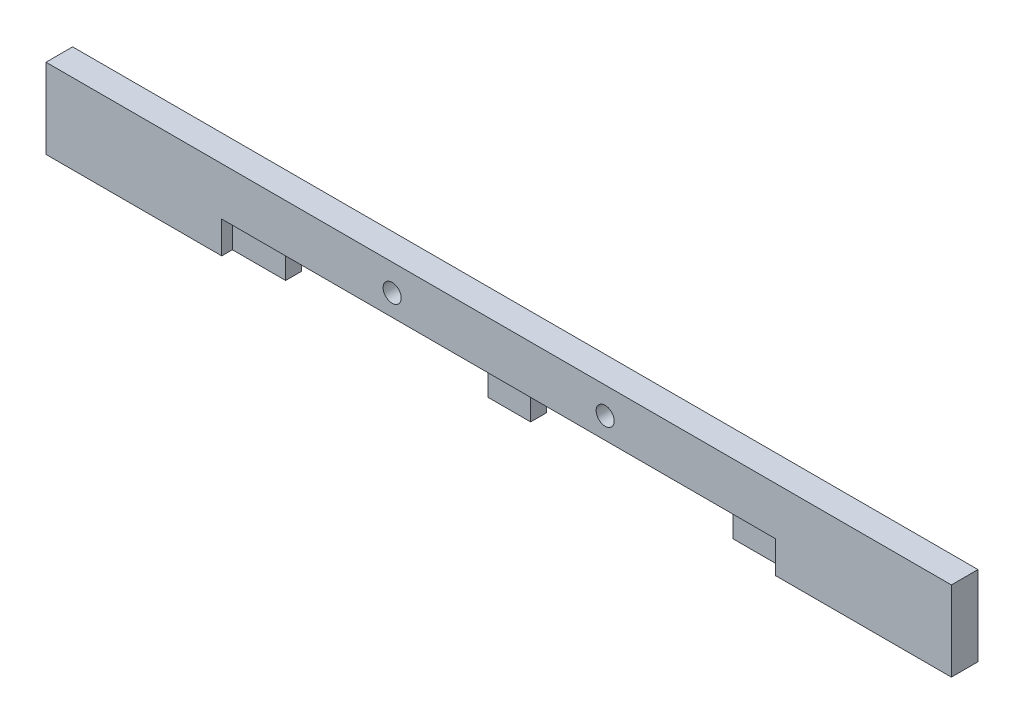
ISO-10303-21;
HEADER;
FILE_DESCRIPTION(('STEP AP214'),'2;1');
FILE_NAME('part.step','',(''),(''),'','','');
FILE_SCHEMA(('AUTOMOTIVE_DESIGN { 1 0 10303 214 1 1 1 1 }'));
ENDSEC;
DATA;
#1=APPLICATION_CONTEXT('core data for automotive mechanical design processes');
#2=APPLICATION_PROTOCOL_DEFINITION('international standard','automotive_design',2000,#1);
#3=PRODUCT_CONTEXT('',#1,'mechanical');
#4=PRODUCT('Part','Part','',(#3));
#5=PRODUCT_RELATED_PRODUCT_CATEGORY('part','',(#4));
#6=PRODUCT_DEFINITION_FORMATION('','',#4);
#7=PRODUCT_DEFINITION_CONTEXT('part definition',#1,'design');
#8=PRODUCT_DEFINITION('design','',#6,#7);
#9=PRODUCT_DEFINITION_SHAPE('','',#8);
#10=(LENGTH_UNIT() NAMED_UNIT(*) SI_UNIT(.MILLI.,.METRE.));
#11=(NAMED_UNIT(*) PLANE_ANGLE_UNIT() SI_UNIT($,.RADIAN.));
#12=(NAMED_UNIT(*) SI_UNIT($,.STERADIAN.) SOLID_ANGLE_UNIT());
#13=UNCERTAINTY_MEASURE_WITH_UNIT(LENGTH_MEASURE(1.E-05),#10,'distance_accuracy_value','');
#14=(GEOMETRIC_REPRESENTATION_CONTEXT(3) GLOBAL_UNCERTAINTY_ASSIGNED_CONTEXT((#13)) GLOBAL_UNIT_ASSIGNED_CONTEXT((#10,
#11,#12)) REPRESENTATION_CONTEXT('',''));
#15=CARTESIAN_POINT('',(0.,0.,0.));
#16=DIRECTION('',(0.,0.,1.));
#17=DIRECTION('',(1.,0.,0.));
#18=AXIS2_PLACEMENT_3D('',#15,#16,#17);
#19=CARTESIAN_POINT('',(-29.7998399771398,17.5410874971466,3.0000000000001));
#20=DIRECTION('',(0.,0.,-1.));
#21=DIRECTION('',(-1.,0.,0.));
#22=AXIS2_PLACEMENT_3D('',#19,#20,#21);
#23=PLANE('',#22);
#24=DIRECTION('',(1.,0.,0.));
#25=VECTOR('',#24,1.);
#26=CARTESIAN_POINT('',(-104.199192033432,34.2398452611218,3.00000000000009));
#27=LINE('',#26,#25);
#28=CARTESIAN_POINT('',(-56.1991920334325,34.2398452611218,3.00000000000009));
#29=VERTEX_POINT('',#28);
#30=CARTESIAN_POINT('',(-48.1991920334325,34.2398452611218,3.00000000000009));
#31=VERTEX_POINT('',#30);
#32=EDGE_CURVE('E152',#29,#31,#27,.T.);
#33=ORIENTED_EDGE('',*,*,#32,.F.);
#34=DIRECTION('',(0.,1.,0.));
#35=VECTOR('',#34,1.);
#36=CARTESIAN_POINT('',(-56.1991920334325,28.2398452611219,3.00000000000009));
#37=LINE('',#36,#35);
#38=CARTESIAN_POINT('',(-56.1991920334325,28.2398452611219,3.00000000000009));
#39=VERTEX_POINT('',#38);
#40=EDGE_CURVE('E161',#39,#29,#37,.T.);
#41=ORIENTED_EDGE('',*,*,#40,.F.);
#42=DIRECTION('',(-1.,0.,0.));
#43=VECTOR('',#42,1.);
#44=CARTESIAN_POINT('',(-0.199192033432466,28.2398452611219,3.00000000000009));
#45=LINE('',#44,#43);
#46=CARTESIAN_POINT('',(-48.1991920334325,28.2398452611219,3.00000000000009));
#47=VERTEX_POINT('',#46);
#48=EDGE_CURVE('E256',#47,#39,#45,.T.);
#49=ORIENTED_EDGE('',*,*,#48,.F.);
#50=DIRECTION('',(0.,-1.,0.));
#51=VECTOR('',#50,1.);
#52=CARTESIAN_POINT('',(-48.1991920334325,34.2398452611218,3.00000000000009));
#53=LINE('',#52,#51);
#54=EDGE_CURVE('E170',#31,#47,#53,.T.);
#55=ORIENTED_EDGE('',*,*,#54,.F.);
#56=EDGE_LOOP('',(#33,#41,#49,#55));
#57=FACE_BOUND('',#56,.T.);
#58=ADVANCED_FACE('F33',(#57),#23,.F.);
#59=CARTESIAN_POINT('',(-94.1991920334325,28.2398452611219,3.00000000000012));
#60=VERTEX_POINT('',#59);
#61=CARTESIAN_POINT('',(-104.199192033432,28.2398452611219,3.00000000000012));
#62=VERTEX_POINT('',#61);
#63=EDGE_CURVE('E257',#60,#62,#45,.T.);
#64=ORIENTED_EDGE('',*,*,#63,.F.);
#65=DIRECTION('',(0.,-1.,0.));
#66=VECTOR('',#65,1.);
#67=CARTESIAN_POINT('',(-94.1991920334325,28.2398452611219,3.00000000000009));
#68=LINE('',#67,#66);
#69=CARTESIAN_POINT('',(-94.1991920334325,34.2398452611218,3.00000000000009));
#70=VERTEX_POINT('',#69);
#71=EDGE_CURVE('E48',#70,#60,#68,.T.);
#72=ORIENTED_EDGE('',*,*,#71,.F.);
#73=CARTESIAN_POINT('',(-104.199192033432,34.2398452611218,3.00000000000009));
#74=VERTEX_POINT('',#73);
#75=EDGE_CURVE('E171',#74,#70,#27,.T.);
#76=ORIENTED_EDGE('',*,*,#75,.F.);
#77=DIRECTION('',(0.,1.,0.));
#78=VECTOR('',#77,1.);
#79=CARTESIAN_POINT('',(-104.199192033432,33.2398452611218,3.00000000000012));
#80=LINE('',#79,#78);
#81=EDGE_CURVE('E190',#62,#74,#80,.T.);
#82=ORIENTED_EDGE('',*,*,#81,.F.);
#83=EDGE_LOOP('',(#64,#72,#76,#82));
#84=FACE_BOUND('',#83,.T.);
#85=ADVANCED_FACE('F278',(#84),#23,.F.);
#86=CARTESIAN_POINT('',(0.,28.2398452611219,0.));
#87=DIRECTION('',(0.,-1.,0.));
#88=DIRECTION('',(0.,0.,-1.));
#89=AXIS2_PLACEMENT_3D('',#86,#87,#88);
#90=PLANE('',#89);
#91=DIRECTION('',(0.,0.,1.));
#92=VECTOR('',#91,1.);
#93=CARTESIAN_POINT('',(-56.1991920334325,28.2398452611219,0.));
#94=LINE('',#93,#92);
#95=CARTESIAN_POINT('',(-56.1991920334325,28.2398452611219,0.));
#96=VERTEX_POINT('',#95);
#97=EDGE_CURVE('E11',#96,#39,#94,.T.);
#98=ORIENTED_EDGE('',*,*,#97,.F.);
#99=DIRECTION('',(1.,0.,0.));
#100=VECTOR('',#99,1.);
#101=CARTESIAN_POINT('',(-0.199192033432466,28.2398452611219,0.));
#102=LINE('',#101,#100);
#103=CARTESIAN_POINT('',(-48.1991920334325,28.2398452611219,0.));
#104=VERTEX_POINT('',#103);
#105=EDGE_CURVE('E238',#96,#104,#102,.T.);
#106=ORIENTED_EDGE('',*,*,#105,.T.);
#107=DIRECTION('',(0.,0.,-1.));
#108=VECTOR('',#107,1.);
#109=CARTESIAN_POINT('',(-48.1991920334325,28.2398452611219,0.));
#110=LINE('',#109,#108);
#111=EDGE_CURVE('E217',#47,#104,#110,.T.);
#112=ORIENTED_EDGE('',*,*,#111,.F.);
#113=ORIENTED_EDGE('',*,*,#48,.T.);
#114=EDGE_LOOP('',(#98,#106,#112,#113));
#115=FACE_BOUND('',#114,.T.);
#116=ADVANCED_FACE('F329',(#115),#90,.T.);
#117=DIRECTION('',(0.,0.,-1.));
#118=VECTOR('',#117,1.);
#119=CARTESIAN_POINT('',(-94.1991920334325,28.2398452611219,0.));
#120=LINE('',#119,#118);
#121=CARTESIAN_POINT('',(-94.1991920334325,28.2398452611219,0.));
#122=VERTEX_POINT('',#121);
#123=EDGE_CURVE('E41',#60,#122,#120,.T.);
#124=ORIENTED_EDGE('',*,*,#123,.F.);
#125=ORIENTED_EDGE('',*,*,#63,.T.);
#126=DIRECTION('',(0.,0.,1.));
#127=VECTOR('',#126,1.);
#128=CARTESIAN_POINT('',(-104.199192033432,28.2398452611219,3.00000000000012));
#129=LINE('',#128,#127);
#130=CARTESIAN_POINT('',(-104.199192033432,28.2398452611219,5.));
#131=VERTEX_POINT('',#130);
#132=EDGE_CURVE('E249',#62,#131,#129,.T.);
#133=ORIENTED_EDGE('',*,*,#132,.T.);
#134=DIRECTION('',(-1.,0.,0.));
#135=VECTOR('',#134,1.);
#136=CARTESIAN_POINT('',(-104.199192033432,28.2398452611219,5.));
#137=LINE('',#136,#135);
#138=CARTESIAN_POINT('',(-137.199192033432,28.2398452611219,5.));
#139=VERTEX_POINT('',#138);
#140=EDGE_CURVE('E245',#131,#139,#137,.T.);
#141=ORIENTED_EDGE('',*,*,#140,.T.);
#142=DIRECTION('',(0.,0.,-1.));
#143=VECTOR('',#142,1.);
#144=CARTESIAN_POINT('',(-137.199192033432,28.2398452611219,5.));
#145=LINE('',#144,#143);
#146=CARTESIAN_POINT('',(-137.199192033432,28.2398452611219,0.));
#147=VERTEX_POINT('',#146);
#148=EDGE_CURVE('E236',#139,#147,#145,.T.);
#149=ORIENTED_EDGE('',*,*,#148,.T.);
#150=EDGE_CURVE('E230',#147,#122,#102,.T.);
#151=ORIENTED_EDGE('',*,*,#150,.T.);
#152=EDGE_LOOP('',(#124,#125,#133,#141,#149,#151));
#153=FACE_BOUND('',#152,.T.);
#154=ADVANCED_FACE('F234',(#153),#90,.T.);
#155=CARTESIAN_POINT('',(0.,0.,5.));
#156=DIRECTION('',(0.,0.,1.));
#157=DIRECTION('',(1.,0.,0.));
#158=AXIS2_PLACEMENT_3D('',#155,#156,#157);
#159=PLANE('',#158);
#160=CARTESIAN_POINT('',(-72.1991920334325,38.2398452611218,5.));
#161=DIRECTION('',(0.,0.,1.));
#162=DIRECTION('',(1.,0.,0.));
#163=AXIS2_PLACEMENT_3D('',#160,#161,#162);
#164=CIRCLE('',#163,1.69999999999999);
#165=CARTESIAN_POINT('',(-70.4991920334325,38.2398452611218,5.));
#166=VERTEX_POINT('',#165);
#167=EDGE_CURVE('E283',#166,#166,#164,.T.);
#168=ORIENTED_EDGE('',*,*,#167,.F.);
#169=EDGE_LOOP('',(#168));
#170=FACE_BOUND('',#169,.T.);
#171=CARTESIAN_POINT('',(-32.1991920334325,38.2398452611218,5.));
#172=DIRECTION('',(0.,0.,1.));
#173=DIRECTION('',(1.,0.,0.));
#174=AXIS2_PLACEMENT_3D('',#171,#172,#173);
#175=CIRCLE('',#174,1.70000000000001);
#176=CARTESIAN_POINT('',(-30.4991920334324,38.2398452611218,5.));
#177=VERTEX_POINT('',#176);
#178=EDGE_CURVE('E285',#177,#177,#175,.T.);
#179=ORIENTED_EDGE('',*,*,#178,.F.);
#180=EDGE_LOOP('',(#179));
#181=FACE_BOUND('',#180,.T.);
#182=DIRECTION('',(0.,-1.,0.));
#183=VECTOR('',#182,1.);
#184=CARTESIAN_POINT('',(-137.199192033432,43.2398452611219,5.));
#185=LINE('',#184,#183);
#186=CARTESIAN_POINT('',(-137.199192033432,43.2398452611219,5.));
#187=VERTEX_POINT('',#186);
#188=EDGE_CURVE('E196',#187,#139,#185,.T.);
#189=ORIENTED_EDGE('',*,*,#188,.T.);
#190=ORIENTED_EDGE('',*,*,#140,.F.);
#191=DIRECTION('',(0.,-1.,0.));
#192=VECTOR('',#191,1.);
#193=CARTESIAN_POINT('',(-104.199192033432,33.2398452611218,5.));
#194=LINE('',#193,#192);
#195=CARTESIAN_POINT('',(-104.199192033432,34.2398452611218,5.));
#196=VERTEX_POINT('',#195);
#197=EDGE_CURVE('E192',#196,#131,#194,.T.);
#198=ORIENTED_EDGE('',*,*,#197,.F.);
#199=DIRECTION('',(-1.,0.,0.));
#200=VECTOR('',#199,1.);
#201=CARTESIAN_POINT('',(-104.199192033432,34.2398452611218,5.));
#202=LINE('',#201,#200);
#203=CARTESIAN_POINT('',(-0.199192033432466,34.2398452611218,5.));
#204=VERTEX_POINT('',#203);
#205=EDGE_CURVE('E182',#204,#196,#202,.T.);
#206=ORIENTED_EDGE('',*,*,#205,.F.);
#207=DIRECTION('',(0.,1.,0.));
#208=VECTOR('',#207,1.);
#209=CARTESIAN_POINT('',(-0.199192033432467,33.2398452611218,5.));
#210=LINE('',#209,#208);
#211=CARTESIAN_POINT('',(-0.199192033432466,28.2398452611219,5.));
#212=VERTEX_POINT('',#211);
#213=EDGE_CURVE('E188',#212,#204,#210,.T.);
#214=ORIENTED_EDGE('',*,*,#213,.F.);
#215=DIRECTION('',(-1.,0.,0.));
#216=VECTOR('',#215,1.);
#217=CARTESIAN_POINT('',(33.2310731982872,28.2398452611219,5.));
#218=LINE('',#217,#216);
#219=CARTESIAN_POINT('',(32.8008079665675,28.2398452611219,5.));
#220=VERTEX_POINT('',#219);
#221=EDGE_CURVE('E237',#220,#212,#218,.T.);
#222=ORIENTED_EDGE('',*,*,#221,.F.);
#223=DIRECTION('',(0.,1.,0.));
#224=VECTOR('',#223,1.);
#225=CARTESIAN_POINT('',(32.8008079665675,43.2398452611219,5.));
#226=LINE('',#225,#224);
#227=CARTESIAN_POINT('',(32.8008079665675,43.2398452611219,5.));
#228=VERTEX_POINT('',#227);
#229=EDGE_CURVE('E199',#220,#228,#226,.T.);
#230=ORIENTED_EDGE('',*,*,#229,.T.);
#231=DIRECTION('',(-1.,0.,0.));
#232=VECTOR('',#231,1.);
#233=CARTESIAN_POINT('',(-137.199192033432,43.2398452611219,5.));
#234=LINE('',#233,#232);
#235=EDGE_CURVE('E202',#228,#187,#234,.T.);
#236=ORIENTED_EDGE('',*,*,#235,.T.);
#237=EDGE_LOOP('',(#189,#190,#198,#206,#214,#222,#230,#236));
#238=FACE_BOUND('',#237,.T.);
#239=ADVANCED_FACE('F306',(#170,#181,#238),#159,.T.);
#240=CARTESIAN_POINT('',(-137.199192033432,43.2398452611219,5.));
#241=DIRECTION('',(1.,0.,0.));
#242=DIRECTION('',(0.,1.,0.));
#243=AXIS2_PLACEMENT_3D('',#240,#241,#242);
#244=PLANE('',#243);
#245=ORIENTED_EDGE('',*,*,#148,.F.);
#246=ORIENTED_EDGE('',*,*,#188,.F.);
#247=DIRECTION('',(0.,0.,-1.));
#248=VECTOR('',#247,1.);
#249=CARTESIAN_POINT('',(-137.199192033432,43.2398452611219,5.));
#250=LINE('',#249,#248);
#251=CARTESIAN_POINT('',(-137.199192033432,43.2398452611219,0.));
#252=VERTEX_POINT('',#251);
#253=EDGE_CURVE('E204',#187,#252,#250,.T.);
#254=ORIENTED_EDGE('',*,*,#253,.T.);
#255=DIRECTION('',(0.,-1.,0.));
#256=VECTOR('',#255,1.);
#257=CARTESIAN_POINT('',(-137.199192033432,43.2398452611219,0.));
#258=LINE('',#257,#256);
#259=EDGE_CURVE('E195',#252,#147,#258,.T.);
#260=ORIENTED_EDGE('',*,*,#259,.T.);
#261=EDGE_LOOP('',(#245,#246,#254,#260));
#262=FACE_BOUND('',#261,.T.);
#263=ADVANCED_FACE('F35',(#262),#244,.F.);
#264=CARTESIAN_POINT('',(32.8008079665675,43.2398452611219,5.));
#265=DIRECTION('',(-1.,0.,0.));
#266=DIRECTION('',(0.,0.,1.));
#267=AXIS2_PLACEMENT_3D('',#264,#265,#266);
#268=PLANE('',#267);
#269=DIRECTION('',(0.,0.,1.));
#270=VECTOR('',#269,1.);
#271=CARTESIAN_POINT('',(32.8008079665675,28.2398452611219,5.));
#272=LINE('',#271,#270);
#273=CARTESIAN_POINT('',(32.8008079665675,28.2398452611219,0.));
#274=VERTEX_POINT('',#273);
#275=EDGE_CURVE('E241',#274,#220,#272,.T.);
#276=ORIENTED_EDGE('',*,*,#275,.F.);
#277=DIRECTION('',(0.,1.,0.));
#278=VECTOR('',#277,1.);
#279=CARTESIAN_POINT('',(32.8008079665675,43.2398452611219,0.));
#280=LINE('',#279,#278);
#281=CARTESIAN_POINT('',(32.8008079665675,43.2398452611219,0.));
#282=VERTEX_POINT('',#281);
#283=EDGE_CURVE('E207',#274,#282,#280,.T.);
#284=ORIENTED_EDGE('',*,*,#283,.T.);
#285=DIRECTION('',(0.,0.,-1.));
#286=VECTOR('',#285,1.);
#287=CARTESIAN_POINT('',(32.8008079665675,43.2398452611219,5.));
#288=LINE('',#287,#286);
#289=EDGE_CURVE('E212',#228,#282,#288,.T.);
#290=ORIENTED_EDGE('',*,*,#289,.F.);
#291=ORIENTED_EDGE('',*,*,#229,.F.);
#292=EDGE_LOOP('',(#276,#284,#290,#291));
#293=FACE_BOUND('',#292,.T.);
#294=ADVANCED_FACE('F308',(#293),#268,.F.);
#295=CARTESIAN_POINT('',(0.,0.,0.));
#296=DIRECTION('',(0.,0.,1.));
#297=DIRECTION('',(1.,0.,0.));
#298=AXIS2_PLACEMENT_3D('',#295,#296,#297);
#299=PLANE('',#298);
#300=ORIENTED_EDGE('',*,*,#105,.F.);
#301=DIRECTION('',(0.,1.,0.));
#302=VECTOR('',#301,1.);
#303=CARTESIAN_POINT('',(-56.1991920334325,0.,0.));
#304=LINE('',#303,#302);
#305=CARTESIAN_POINT('',(-56.1991920334325,34.2398452611218,0.));
#306=VERTEX_POINT('',#305);
#307=EDGE_CURVE('E231',#96,#306,#304,.T.);
#308=ORIENTED_EDGE('',*,*,#307,.T.);
#309=DIRECTION('',(-1.,0.,0.));
#310=VECTOR('',#309,1.);
#311=CARTESIAN_POINT('',(0.,34.2398452611218,0.));
#312=LINE('',#311,#310);
#313=CARTESIAN_POINT('',(-94.1991920334325,34.2398452611218,0.));
#314=VERTEX_POINT('',#313);
#315=EDGE_CURVE('E155',#306,#314,#312,.T.);
#316=ORIENTED_EDGE('',*,*,#315,.T.);
#317=DIRECTION('',(0.,-1.,0.));
#318=VECTOR('',#317,1.);
#319=CARTESIAN_POINT('',(-94.1991920334325,0.,0.));
#320=LINE('',#319,#318);
#321=EDGE_CURVE('E220',#314,#122,#320,.T.);
#322=ORIENTED_EDGE('',*,*,#321,.T.);
#323=ORIENTED_EDGE('',*,*,#150,.F.);
#324=ORIENTED_EDGE('',*,*,#259,.F.);
#325=DIRECTION('',(-1.,0.,0.));
#326=VECTOR('',#325,1.);
#327=CARTESIAN_POINT('',(-137.199192033432,43.2398452611219,0.));
#328=LINE('',#327,#326);
#329=EDGE_CURVE('E200',#282,#252,#328,.T.);
#330=ORIENTED_EDGE('',*,*,#329,.F.);
#331=ORIENTED_EDGE('',*,*,#283,.F.);
#332=CARTESIAN_POINT('',(-10.1991920334325,28.2398452611219,0.));
#333=VERTEX_POINT('',#332);
#334=EDGE_CURVE('E240',#333,#274,#102,.T.);
#335=ORIENTED_EDGE('',*,*,#334,.F.);
#336=DIRECTION('',(0.,1.,0.));
#337=VECTOR('',#336,1.);
#338=CARTESIAN_POINT('',(-10.1991920334325,0.,0.));
#339=LINE('',#338,#337);
#340=CARTESIAN_POINT('',(-10.1991920334325,34.2398452611218,0.));
#341=VERTEX_POINT('',#340);
#342=EDGE_CURVE('E56',#333,#341,#339,.T.);
#343=ORIENTED_EDGE('',*,*,#342,.T.);
#344=DIRECTION('',(-1.,0.,0.));
#345=VECTOR('',#344,1.);
#346=CARTESIAN_POINT('',(0.,34.2398452611218,0.));
#347=LINE('',#346,#345);
#348=CARTESIAN_POINT('',(-48.1991920334325,34.2398452611218,0.));
#349=VERTEX_POINT('',#348);
#350=EDGE_CURVE('E261',#341,#349,#347,.T.);
#351=ORIENTED_EDGE('',*,*,#350,.T.);
#352=DIRECTION('',(0.,-1.,0.));
#353=VECTOR('',#352,1.);
#354=CARTESIAN_POINT('',(-48.1991920334325,0.,0.));
#355=LINE('',#354,#353);
#356=EDGE_CURVE('E232',#349,#104,#355,.T.);
#357=ORIENTED_EDGE('',*,*,#356,.T.);
#358=EDGE_LOOP('',(#300,#308,#316,#322,#323,#324,#330,#331,#335,#343,#351,#357));
#359=FACE_BOUND('',#358,.T.);
#360=CARTESIAN_POINT('',(-32.1991920334325,38.2398452611218,0.));
#361=DIRECTION('',(0.,0.,-1.));
#362=DIRECTION('',(-1.,0.,0.));
#363=AXIS2_PLACEMENT_3D('',#360,#361,#362);
#364=CIRCLE('',#363,1.70000000000001);
#365=CARTESIAN_POINT('',(-33.8991920334325,38.2398452611218,0.));
#366=VERTEX_POINT('',#365);
#367=EDGE_CURVE('E292',#366,#366,#364,.T.);
#368=ORIENTED_EDGE('',*,*,#367,.F.);
#369=EDGE_LOOP('',(#368));
#370=FACE_BOUND('',#369,.T.);
#371=CARTESIAN_POINT('',(-72.1991920334325,38.2398452611218,0.));
#372=DIRECTION('',(0.,0.,-1.));
#373=DIRECTION('',(-1.,0.,0.));
#374=AXIS2_PLACEMENT_3D('',#371,#372,#373);
#375=CIRCLE('',#374,1.69999999999999);
#376=CARTESIAN_POINT('',(-73.8991920334324,38.2398452611218,0.));
#377=VERTEX_POINT('',#376);
#378=EDGE_CURVE('E289',#377,#377,#375,.T.);
#379=ORIENTED_EDGE('',*,*,#378,.F.);
#380=EDGE_LOOP('',(#379));
#381=FACE_BOUND('',#380,.T.);
#382=ADVANCED_FACE('F227',(#359,#370,#381),#299,.F.);
#383=CARTESIAN_POINT('',(-10.1991920334325,34.2398452611218,3.00000000000009));
#384=VERTEX_POINT('',#383);
#385=CARTESIAN_POINT('',(-0.199192033432466,34.2398452611218,3.00000000000009));
#386=VERTEX_POINT('',#385);
#387=EDGE_CURVE('E172',#384,#386,#27,.T.);
#388=ORIENTED_EDGE('',*,*,#387,.F.);
#389=DIRECTION('',(0.,1.,0.));
#390=VECTOR('',#389,1.);
#391=CARTESIAN_POINT('',(-10.1991920334325,34.2398452611218,3.00000000000009));
#392=LINE('',#391,#390);
#393=CARTESIAN_POINT('',(-10.1991920334325,28.2398452611219,3.00000000000009));
#394=VERTEX_POINT('',#393);
#395=EDGE_CURVE('E272',#394,#384,#392,.T.);
#396=ORIENTED_EDGE('',*,*,#395,.F.);
#397=CARTESIAN_POINT('',(-0.199192033432466,28.2398452611219,3.00000000000009));
#398=VERTEX_POINT('',#397);
#399=EDGE_CURVE('E251',#398,#394,#45,.T.);
#400=ORIENTED_EDGE('',*,*,#399,.F.);
#401=DIRECTION('',(0.,-1.,0.));
#402=VECTOR('',#401,1.);
#403=CARTESIAN_POINT('',(-0.199192033432467,33.2398452611218,3.00000000000009));
#404=LINE('',#403,#402);
#405=EDGE_CURVE('E185',#386,#398,#404,.T.);
#406=ORIENTED_EDGE('',*,*,#405,.F.);
#407=EDGE_LOOP('',(#388,#396,#400,#406));
#408=FACE_BOUND('',#407,.T.);
#409=ADVANCED_FACE('F322',(#408),#23,.F.);
#410=CARTESIAN_POINT('',(-104.199192033432,0.,0.));
#411=DIRECTION('',(-1.,0.,0.));
#412=DIRECTION('',(0.,0.,1.));
#413=AXIS2_PLACEMENT_3D('',#410,#411,#412);
#414=PLANE('',#413);
#415=ORIENTED_EDGE('',*,*,#132,.F.);
#416=ORIENTED_EDGE('',*,*,#81,.T.);
#417=DIRECTION('',(0.,0.,-1.));
#418=VECTOR('',#417,1.);
#419=CARTESIAN_POINT('',(-104.199192033432,34.2398452611218,5.));
#420=LINE('',#419,#418);
#421=EDGE_CURVE('E176',#196,#74,#420,.T.);
#422=ORIENTED_EDGE('',*,*,#421,.F.);
#423=ORIENTED_EDGE('',*,*,#197,.T.);
#424=EDGE_LOOP('',(#415,#416,#422,#423));
#425=FACE_BOUND('',#424,.T.);
#426=ADVANCED_FACE('F326',(#425),#414,.F.);
#427=CARTESIAN_POINT('',(-0.199192033432465,0.,0.));
#428=DIRECTION('',(-1.,0.,0.));
#429=DIRECTION('',(0.,0.,1.));
#430=AXIS2_PLACEMENT_3D('',#427,#428,#429);
#431=PLANE('',#430);
#432=ORIENTED_EDGE('',*,*,#405,.T.);
#433=DIRECTION('',(0.,0.,-1.));
#434=VECTOR('',#433,1.);
#435=CARTESIAN_POINT('',(-0.199192033432466,28.2398452611219,3.00000000000009));
#436=LINE('',#435,#434);
#437=EDGE_CURVE('E258',#212,#398,#436,.T.);
#438=ORIENTED_EDGE('',*,*,#437,.F.);
#439=ORIENTED_EDGE('',*,*,#213,.T.);
#440=DIRECTION('',(0.,0.,1.));
#441=VECTOR('',#440,1.);
#442=CARTESIAN_POINT('',(-0.199192033432466,34.2398452611218,5.));
#443=LINE('',#442,#441);
#444=EDGE_CURVE('E175',#386,#204,#443,.T.);
#445=ORIENTED_EDGE('',*,*,#444,.F.);
#446=EDGE_LOOP('',(#432,#438,#439,#445));
#447=FACE_BOUND('',#446,.T.);
#448=ADVANCED_FACE('F357',(#447),#431,.T.);
#449=CARTESIAN_POINT('',(-137.199192033432,43.2398452611219,5.));
#450=DIRECTION('',(0.,-1.,0.));
#451=DIRECTION('',(0.,0.,-1.));
#452=AXIS2_PLACEMENT_3D('',#449,#450,#451);
#453=PLANE('',#452);
#454=ORIENTED_EDGE('',*,*,#329,.T.);
#455=ORIENTED_EDGE('',*,*,#253,.F.);
#456=ORIENTED_EDGE('',*,*,#235,.F.);
#457=ORIENTED_EDGE('',*,*,#289,.T.);
#458=EDGE_LOOP('',(#454,#455,#456,#457));
#459=FACE_BOUND('',#458,.T.);
#460=ADVANCED_FACE('F313',(#459),#453,.F.);
#461=CARTESIAN_POINT('',(0.,34.2398452611218,0.));
#462=DIRECTION('',(0.,-1.,0.));
#463=DIRECTION('',(0.,0.,-1.));
#464=AXIS2_PLACEMENT_3D('',#461,#462,#463);
#465=PLANE('',#464);
#466=ORIENTED_EDGE('',*,*,#421,.T.);
#467=ORIENTED_EDGE('',*,*,#75,.T.);
#468=DIRECTION('',(0.,0.,1.));
#469=VECTOR('',#468,1.);
#470=CARTESIAN_POINT('',(-94.1991920334325,34.2398452611218,-6.99999999999991));
#471=LINE('',#470,#469);
#472=EDGE_CURVE('E158',#314,#70,#471,.T.);
#473=ORIENTED_EDGE('',*,*,#472,.F.);
#474=ORIENTED_EDGE('',*,*,#315,.F.);
#475=DIRECTION('',(0.,0.,1.));
#476=VECTOR('',#475,1.);
#477=CARTESIAN_POINT('',(-56.1991920334325,34.2398452611218,-6.99999999999991));
#478=LINE('',#477,#476);
#479=EDGE_CURVE('E146',#306,#29,#478,.T.);
#480=ORIENTED_EDGE('',*,*,#479,.T.);
#481=ORIENTED_EDGE('',*,*,#32,.T.);
#482=DIRECTION('',(0.,0.,1.));
#483=VECTOR('',#482,1.);
#484=CARTESIAN_POINT('',(-48.1991920334325,34.2398452611218,-6.99999999999991));
#485=LINE('',#484,#483);
#486=EDGE_CURVE('E167',#349,#31,#485,.T.);
#487=ORIENTED_EDGE('',*,*,#486,.F.);
#488=ORIENTED_EDGE('',*,*,#350,.F.);
#489=DIRECTION('',(0.,0.,1.));
#490=VECTOR('',#489,1.);
#491=CARTESIAN_POINT('',(-10.1991920334325,34.2398452611218,-6.99999999999991));
#492=LINE('',#491,#490);
#493=EDGE_CURVE('E268',#341,#384,#492,.T.);
#494=ORIENTED_EDGE('',*,*,#493,.T.);
#495=ORIENTED_EDGE('',*,*,#387,.T.);
#496=ORIENTED_EDGE('',*,*,#444,.T.);
#497=ORIENTED_EDGE('',*,*,#205,.T.);
#498=EDGE_LOOP('',(#466,#467,#473,#474,#480,#481,#487,#488,#494,#495,#496,#497));
#499=FACE_BOUND('',#498,.T.);
#500=ADVANCED_FACE('F149',(#499),#465,.T.);
#501=CARTESIAN_POINT('',(-32.1991920334325,38.2398452611218,10.));
#502=DIRECTION('',(0.,0.,-1.));
#503=DIRECTION('',(-1.,0.,0.));
#504=AXIS2_PLACEMENT_3D('',#501,#502,#503);
#505=CYLINDRICAL_SURFACE('',#504,1.70000000000001);
#506=ORIENTED_EDGE('',*,*,#178,.T.);
#507=EDGE_LOOP('',(#506));
#508=FACE_BOUND('',#507,.T.);
#509=ORIENTED_EDGE('',*,*,#367,.T.);
#510=EDGE_LOOP('',(#509));
#511=FACE_BOUND('',#510,.T.);
#512=ADVANCED_FACE('F369',(#508,#511),#505,.F.);
#513=CARTESIAN_POINT('',(-72.1991920334325,38.2398452611218,10.));
#514=DIRECTION('',(0.,0.,-1.));
#515=DIRECTION('',(-1.,0.,0.));
#516=AXIS2_PLACEMENT_3D('',#513,#514,#515);
#517=CYLINDRICAL_SURFACE('',#516,1.69999999999999);
#518=ORIENTED_EDGE('',*,*,#167,.T.);
#519=EDGE_LOOP('',(#518));
#520=FACE_BOUND('',#519,.T.);
#521=ORIENTED_EDGE('',*,*,#378,.T.);
#522=EDGE_LOOP('',(#521));
#523=FACE_BOUND('',#522,.T.);
#524=ADVANCED_FACE('F340',(#520,#523),#517,.F.);
#525=DIRECTION('',(0.,0.,1.));
#526=VECTOR('',#525,1.);
#527=CARTESIAN_POINT('',(-10.1991920334325,28.2398452611219,0.));
#528=LINE('',#527,#526);
#529=EDGE_CURVE('E215',#333,#394,#528,.T.);
#530=ORIENTED_EDGE('',*,*,#529,.F.);
#531=ORIENTED_EDGE('',*,*,#334,.T.);
#532=ORIENTED_EDGE('',*,*,#275,.T.);
#533=ORIENTED_EDGE('',*,*,#221,.T.);
#534=ORIENTED_EDGE('',*,*,#437,.T.);
#535=ORIENTED_EDGE('',*,*,#399,.T.);
#536=EDGE_LOOP('',(#530,#531,#532,#533,#534,#535));
#537=FACE_BOUND('',#536,.T.);
#538=ADVANCED_FACE('F299',(#537),#90,.T.);
#539=CARTESIAN_POINT('',(-48.1991920334325,34.2398452611218,-6.99999999999991));
#540=DIRECTION('',(-1.,0.,0.));
#541=DIRECTION('',(0.,0.,1.));
#542=AXIS2_PLACEMENT_3D('',#539,#540,#541);
#543=PLANE('',#542);
#544=ORIENTED_EDGE('',*,*,#486,.T.);
#545=ORIENTED_EDGE('',*,*,#54,.T.);
#546=ORIENTED_EDGE('',*,*,#111,.T.);
#547=ORIENTED_EDGE('',*,*,#356,.F.);
#548=EDGE_LOOP('',(#544,#545,#546,#547));
#549=FACE_BOUND('',#548,.T.);
#550=ADVANCED_FACE('F331',(#549),#543,.F.);
#551=CARTESIAN_POINT('',(-10.1991920334325,34.2398452611218,-6.99999999999991));
#552=DIRECTION('',(1.,0.,0.));
#553=DIRECTION('',(0.,0.,-1.));
#554=AXIS2_PLACEMENT_3D('',#551,#552,#553);
#555=PLANE('',#554);
#556=ORIENTED_EDGE('',*,*,#529,.T.);
#557=ORIENTED_EDGE('',*,*,#395,.T.);
#558=ORIENTED_EDGE('',*,*,#493,.F.);
#559=ORIENTED_EDGE('',*,*,#342,.F.);
#560=EDGE_LOOP('',(#556,#557,#558,#559));
#561=FACE_BOUND('',#560,.T.);
#562=ADVANCED_FACE('F316',(#561),#555,.F.);
#563=CARTESIAN_POINT('',(-56.1991920334325,28.2398452611219,-6.99999999999991));
#564=DIRECTION('',(1.,0.,0.));
#565=DIRECTION('',(0.,0.,-1.));
#566=AXIS2_PLACEMENT_3D('',#563,#564,#565);
#567=PLANE('',#566);
#568=ORIENTED_EDGE('',*,*,#97,.T.);
#569=ORIENTED_EDGE('',*,*,#40,.T.);
#570=ORIENTED_EDGE('',*,*,#479,.F.);
#571=ORIENTED_EDGE('',*,*,#307,.F.);
#572=EDGE_LOOP('',(#568,#569,#570,#571));
#573=FACE_BOUND('',#572,.T.);
#574=ADVANCED_FACE('F162',(#573),#567,.F.);
#575=CARTESIAN_POINT('',(-94.1991920334325,28.2398452611219,-6.99999999999991));
#576=DIRECTION('',(-1.,0.,0.));
#577=DIRECTION('',(0.,0.,1.));
#578=AXIS2_PLACEMENT_3D('',#575,#576,#577);
#579=PLANE('',#578);
#580=ORIENTED_EDGE('',*,*,#472,.T.);
#581=ORIENTED_EDGE('',*,*,#71,.T.);
#582=ORIENTED_EDGE('',*,*,#123,.T.);
#583=ORIENTED_EDGE('',*,*,#321,.F.);
#584=EDGE_LOOP('',(#580,#581,#582,#583));
#585=FACE_BOUND('',#584,.T.);
#586=ADVANCED_FACE('F219',(#585),#579,.F.);
#587=CLOSED_SHELL('',(#58,#85,#116,#154,#239,#263,#294,#382,#409,#426,#448,#460,#500,#512,#524,
#538,#550,#562,#574,#586));
#588=MANIFOLD_SOLID_BREP('B2',#587);
#589=ADVANCED_BREP_SHAPE_REPRESENTATION('',(#18,#588),#14);
#590=SHAPE_DEFINITION_REPRESENTATION(#9,#589);
ENDSEC;
END-ISO-10303-21;
